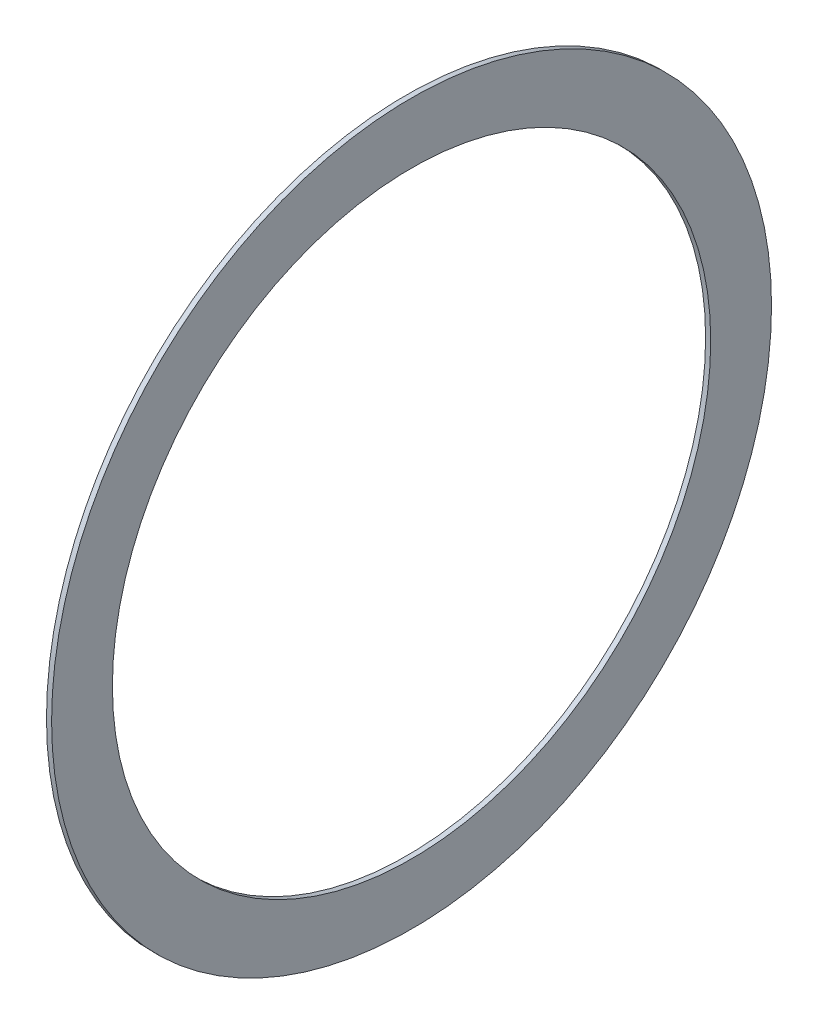
ISO-10303-21;
HEADER;
FILE_DESCRIPTION(('STEP AP214'),'2;1');
FILE_NAME('part.step','',(''),(''),'','','');
FILE_SCHEMA(('AUTOMOTIVE_DESIGN { 1 0 10303 214 1 1 1 1 }'));
ENDSEC;
DATA;
#1=APPLICATION_CONTEXT('core data for automotive mechanical design processes');
#2=APPLICATION_PROTOCOL_DEFINITION('international standard','automotive_design',2000,#1);
#3=PRODUCT_CONTEXT('',#1,'mechanical');
#4=PRODUCT('Part','Part','',(#3));
#5=PRODUCT_RELATED_PRODUCT_CATEGORY('part','',(#4));
#6=PRODUCT_DEFINITION_FORMATION('','',#4);
#7=PRODUCT_DEFINITION_CONTEXT('part definition',#1,'design');
#8=PRODUCT_DEFINITION('design','',#6,#7);
#9=PRODUCT_DEFINITION_SHAPE('','',#8);
#10=(LENGTH_UNIT() NAMED_UNIT(*) SI_UNIT(.MILLI.,.METRE.));
#11=(NAMED_UNIT(*) PLANE_ANGLE_UNIT() SI_UNIT($,.RADIAN.));
#12=(NAMED_UNIT(*) SI_UNIT($,.STERADIAN.) SOLID_ANGLE_UNIT());
#13=UNCERTAINTY_MEASURE_WITH_UNIT(LENGTH_MEASURE(1.E-05),#10,'distance_accuracy_value','');
#14=(GEOMETRIC_REPRESENTATION_CONTEXT(3) GLOBAL_UNCERTAINTY_ASSIGNED_CONTEXT((#13)) GLOBAL_UNIT_ASSIGNED_CONTEXT((#10,
#11,#12)) REPRESENTATION_CONTEXT('',''));
#15=CARTESIAN_POINT('',(0.,0.,0.));
#16=DIRECTION('',(0.,0.,1.));
#17=DIRECTION('',(1.,0.,0.));
#18=AXIS2_PLACEMENT_3D('',#15,#16,#17);
#19=CARTESIAN_POINT('',(0.23,9.94,0.));
#20=DIRECTION('',(1.,0.,0.));
#21=DIRECTION('',(0.,1.,0.));
#22=AXIS2_PLACEMENT_3D('',#19,#20,#21);
#23=PLANE('',#22);
#24=CARTESIAN_POINT('',(0.23,0.,0.));
#25=DIRECTION('',(1.,0.,0.));
#26=DIRECTION('',(0.,0.,-1.));
#27=AXIS2_PLACEMENT_3D('',#24,#25,#26);
#28=CIRCLE('',#27,9.94);
#29=CARTESIAN_POINT('',(0.23,0.,-9.94));
#30=VERTEX_POINT('',#29);
#31=EDGE_CURVE('E10',#30,#30,#28,.T.);
#32=ORIENTED_EDGE('',*,*,#31,.F.);
#33=EDGE_LOOP('',(#32));
#34=FACE_BOUND('',#33,.T.);
#35=CARTESIAN_POINT('',(0.23,0.,0.));
#36=DIRECTION('',(1.,0.,0.));
#37=DIRECTION('',(0.,0.,-1.));
#38=AXIS2_PLACEMENT_3D('',#35,#36,#37);
#39=CIRCLE('',#38,11.960005);
#40=CARTESIAN_POINT('',(0.23,0.,-11.960005));
#41=VERTEX_POINT('',#40);
#42=EDGE_CURVE('E34',#41,#41,#39,.T.);
#43=ORIENTED_EDGE('',*,*,#42,.T.);
#44=EDGE_LOOP('',(#43));
#45=FACE_BOUND('',#44,.T.);
#46=ADVANCED_FACE('F15',(#34,#45),#23,.T.);
#47=CARTESIAN_POINT('',(0.23,0.,0.));
#48=DIRECTION('',(1.,0.,0.));
#49=DIRECTION('',(0.,0.,-1.));
#50=AXIS2_PLACEMENT_3D('',#47,#48,#49);
#51=CYLINDRICAL_SURFACE('',#50,9.94);
#52=ORIENTED_EDGE('',*,*,#31,.T.);
#53=EDGE_LOOP('',(#52));
#54=FACE_BOUND('',#53,.T.);
#55=CARTESIAN_POINT('',(0.06,0.,0.));
#56=DIRECTION('',(1.,0.,0.));
#57=DIRECTION('',(0.,0.,-1.));
#58=AXIS2_PLACEMENT_3D('',#55,#56,#57);
#59=CIRCLE('',#58,9.94);
#60=CARTESIAN_POINT('',(0.06,0.,-9.94));
#61=VERTEX_POINT('',#60);
#62=EDGE_CURVE('E23',#61,#61,#59,.T.);
#63=ORIENTED_EDGE('',*,*,#62,.F.);
#64=EDGE_LOOP('',(#63));
#65=FACE_BOUND('',#64,.T.);
#66=ADVANCED_FACE('F52',(#54,#65),#51,.F.);
#67=CARTESIAN_POINT('',(0.06,11.960005,0.));
#68=DIRECTION('',(-1.,0.,0.));
#69=DIRECTION('',(0.,0.,1.));
#70=AXIS2_PLACEMENT_3D('',#67,#68,#69);
#71=PLANE('',#70);
#72=ORIENTED_EDGE('',*,*,#62,.T.);
#73=EDGE_LOOP('',(#72));
#74=FACE_BOUND('',#73,.T.);
#75=CARTESIAN_POINT('',(0.06,0.,0.));
#76=DIRECTION('',(1.,0.,0.));
#77=DIRECTION('',(0.,0.,-1.));
#78=AXIS2_PLACEMENT_3D('',#75,#76,#77);
#79=CIRCLE('',#78,11.960005);
#80=CARTESIAN_POINT('',(0.06,0.,-11.960005));
#81=VERTEX_POINT('',#80);
#82=EDGE_CURVE('E18',#81,#81,#79,.T.);
#83=ORIENTED_EDGE('',*,*,#82,.F.);
#84=EDGE_LOOP('',(#83));
#85=FACE_BOUND('',#84,.T.);
#86=ADVANCED_FACE('F50',(#74,#85),#71,.T.);
#87=CARTESIAN_POINT('',(0.23,0.,0.));
#88=DIRECTION('',(1.,0.,0.));
#89=DIRECTION('',(0.,0.,-1.));
#90=AXIS2_PLACEMENT_3D('',#87,#88,#89);
#91=CYLINDRICAL_SURFACE('',#90,11.960005);
#92=ORIENTED_EDGE('',*,*,#82,.T.);
#93=EDGE_LOOP('',(#92));
#94=FACE_BOUND('',#93,.T.);
#95=ORIENTED_EDGE('',*,*,#42,.F.);
#96=EDGE_LOOP('',(#95));
#97=FACE_BOUND('',#96,.T.);
#98=ADVANCED_FACE('F47',(#94,#97),#91,.T.);
#99=CLOSED_SHELL('',(#46,#66,#86,#98));
#100=MANIFOLD_SOLID_BREP('B1',#99);
#101=ADVANCED_BREP_SHAPE_REPRESENTATION('',(#18,#100),#14);
#102=SHAPE_DEFINITION_REPRESENTATION(#9,#101);
ENDSEC;
END-ISO-10303-21;
